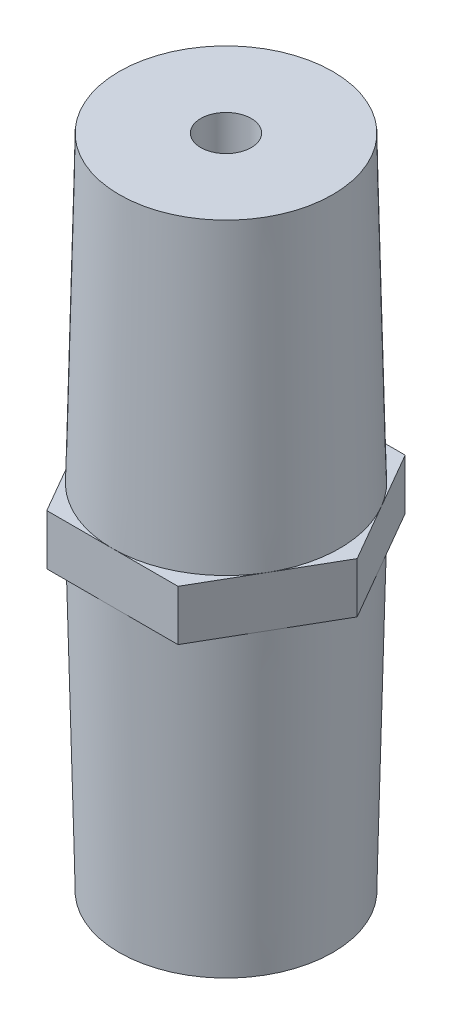
ISO-10303-21;
HEADER;
FILE_DESCRIPTION(('STEP AP214'),'2;1');
FILE_NAME('part.step','',(''),(''),'','','');
FILE_SCHEMA(('AUTOMOTIVE_DESIGN { 1 0 10303 214 1 1 1 1 }'));
ENDSEC;
DATA;
#1=APPLICATION_CONTEXT('core data for automotive mechanical design processes');
#2=APPLICATION_PROTOCOL_DEFINITION('international standard','automotive_design',2000,#1);
#3=PRODUCT_CONTEXT('',#1,'mechanical');
#4=PRODUCT('Part','Part','',(#3));
#5=PRODUCT_RELATED_PRODUCT_CATEGORY('part','',(#4));
#6=PRODUCT_DEFINITION_FORMATION('','',#4);
#7=PRODUCT_DEFINITION_CONTEXT('part definition',#1,'design');
#8=PRODUCT_DEFINITION('design','',#6,#7);
#9=PRODUCT_DEFINITION_SHAPE('','',#8);
#10=(LENGTH_UNIT() NAMED_UNIT(*) SI_UNIT(.MILLI.,.METRE.));
#11=(NAMED_UNIT(*) PLANE_ANGLE_UNIT() SI_UNIT($,.RADIAN.));
#12=(NAMED_UNIT(*) SI_UNIT($,.STERADIAN.) SOLID_ANGLE_UNIT());
#13=UNCERTAINTY_MEASURE_WITH_UNIT(LENGTH_MEASURE(1.E-05),#10,'distance_accuracy_value','');
#14=(GEOMETRIC_REPRESENTATION_CONTEXT(3) GLOBAL_UNCERTAINTY_ASSIGNED_CONTEXT((#13)) GLOBAL_UNIT_ASSIGNED_CONTEXT((#10,
#11,#12)) REPRESENTATION_CONTEXT('',''));
#15=CARTESIAN_POINT('',(0.,0.,0.));
#16=DIRECTION('',(0.,0.,1.));
#17=DIRECTION('',(1.,0.,0.));
#18=AXIS2_PLACEMENT_3D('',#15,#16,#17);
#19=CARTESIAN_POINT('',(0.,-1.5875,0.));
#20=DIRECTION('',(0.,-1.,0.));
#21=DIRECTION('',(0.,0.,1.));
#22=AXIS2_PLACEMENT_3D('',#19,#20,#21);
#23=PLANE('',#22);
#24=DIRECTION('',(1.,0.,0.));
#25=VECTOR('',#24,1.);
#26=CARTESIAN_POINT('',(-4.12444598552339,-1.5875,7.14375));
#27=LINE('',#26,#25);
#28=CARTESIAN_POINT('',(0.,-1.5875,7.14375));
#29=VERTEX_POINT('',#28);
#30=CARTESIAN_POINT('',(4.12444598552339,-1.5875,7.14375));
#31=VERTEX_POINT('',#30);
#32=EDGE_CURVE('E137',#29,#31,#27,.T.);
#33=ORIENTED_EDGE('',*,*,#32,.F.);
#34=CARTESIAN_POINT('',(0.,-1.5875,0.));
#35=DIRECTION('',(0.,1.,0.));
#36=DIRECTION('',(0.,0.,1.));
#37=AXIS2_PLACEMENT_3D('',#34,#35,#36);
#38=CIRCLE('',#37,7.14375);
#39=CARTESIAN_POINT('',(6.18666897828508,-1.5875,3.571875));
#40=VERTEX_POINT('',#39);
#41=EDGE_CURVE('E49',#29,#40,#38,.T.);
#42=ORIENTED_EDGE('',*,*,#41,.T.);
#43=DIRECTION('',(0.5,0.,-0.866025403784439));
#44=VECTOR('',#43,1.);
#45=CARTESIAN_POINT('',(4.12444598552339,-1.5875,7.14375));
#46=LINE('',#45,#44);
#47=EDGE_CURVE('E136',#31,#40,#46,.T.);
#48=ORIENTED_EDGE('',*,*,#47,.F.);
#49=EDGE_LOOP('',(#33,#42,#48));
#50=FACE_BOUND('',#49,.T.);
#51=ADVANCED_FACE('F38',(#50),#23,.T.);
#52=CARTESIAN_POINT('',(8.24889197104678,-1.5875,0.));
#53=VERTEX_POINT('',#52);
#54=EDGE_CURVE('E142',#40,#53,#46,.T.);
#55=ORIENTED_EDGE('',*,*,#54,.F.);
#56=CARTESIAN_POINT('',(6.18666897828508,-1.5875,-3.571875));
#57=VERTEX_POINT('',#56);
#58=EDGE_CURVE('E11',#40,#57,#38,.T.);
#59=ORIENTED_EDGE('',*,*,#58,.T.);
#60=DIRECTION('',(-0.5,0.,-0.866025403784439));
#61=VECTOR('',#60,1.);
#62=CARTESIAN_POINT('',(8.24889197104678,-1.5875,0.));
#63=LINE('',#62,#61);
#64=EDGE_CURVE('E145',#53,#57,#63,.T.);
#65=ORIENTED_EDGE('',*,*,#64,.F.);
#66=EDGE_LOOP('',(#55,#59,#65));
#67=FACE_BOUND('',#66,.T.);
#68=ADVANCED_FACE('F143',(#67),#23,.T.);
#69=CARTESIAN_POINT('',(4.12444598552339,-1.5875,-7.14375));
#70=VERTEX_POINT('',#69);
#71=EDGE_CURVE('E170',#57,#70,#63,.T.);
#72=ORIENTED_EDGE('',*,*,#71,.F.);
#73=CARTESIAN_POINT('',(0.,-1.5875,-7.14375));
#74=VERTEX_POINT('',#73);
#75=EDGE_CURVE('E47',#57,#74,#38,.T.);
#76=ORIENTED_EDGE('',*,*,#75,.T.);
#77=DIRECTION('',(-1.,0.,0.));
#78=VECTOR('',#77,1.);
#79=CARTESIAN_POINT('',(4.12444598552339,-1.5875,-7.14375));
#80=LINE('',#79,#78);
#81=EDGE_CURVE('E167',#70,#74,#80,.T.);
#82=ORIENTED_EDGE('',*,*,#81,.F.);
#83=EDGE_LOOP('',(#72,#76,#82));
#84=FACE_BOUND('',#83,.T.);
#85=ADVANCED_FACE('F300',(#84),#23,.T.);
#86=CARTESIAN_POINT('',(-4.12444598552339,-1.5875,-7.14375));
#87=VERTEX_POINT('',#86);
#88=EDGE_CURVE('E166',#74,#87,#80,.T.);
#89=ORIENTED_EDGE('',*,*,#88,.F.);
#90=CARTESIAN_POINT('',(-6.18666897828508,-1.5875,-3.571875));
#91=VERTEX_POINT('',#90);
#92=EDGE_CURVE('E232',#74,#91,#38,.T.);
#93=ORIENTED_EDGE('',*,*,#92,.T.);
#94=DIRECTION('',(-0.5,0.,0.866025403784439));
#95=VECTOR('',#94,1.);
#96=CARTESIAN_POINT('',(-4.12444598552339,-1.5875,-7.14375));
#97=LINE('',#96,#95);
#98=EDGE_CURVE('E163',#87,#91,#97,.T.);
#99=ORIENTED_EDGE('',*,*,#98,.F.);
#100=EDGE_LOOP('',(#89,#93,#99));
#101=FACE_BOUND('',#100,.T.);
#102=ADVANCED_FACE('F298',(#101),#23,.T.);
#103=CARTESIAN_POINT('',(-8.24889197104677,-1.5875,0.));
#104=VERTEX_POINT('',#103);
#105=EDGE_CURVE('E162',#91,#104,#97,.T.);
#106=ORIENTED_EDGE('',*,*,#105,.F.);
#107=CARTESIAN_POINT('',(-6.18666897828508,-1.5875,3.571875));
#108=VERTEX_POINT('',#107);
#109=EDGE_CURVE('E227',#91,#108,#38,.T.);
#110=ORIENTED_EDGE('',*,*,#109,.T.);
#111=DIRECTION('',(0.5,0.,0.866025403784439));
#112=VECTOR('',#111,1.);
#113=CARTESIAN_POINT('',(-8.24889197104677,-1.5875,0.));
#114=LINE('',#113,#112);
#115=EDGE_CURVE('E159',#104,#108,#114,.T.);
#116=ORIENTED_EDGE('',*,*,#115,.F.);
#117=EDGE_LOOP('',(#106,#110,#116));
#118=FACE_BOUND('',#117,.T.);
#119=ADVANCED_FACE('F294',(#118),#23,.T.);
#120=CARTESIAN_POINT('',(0.,1.5875,0.));
#121=DIRECTION('',(0.,1.,0.));
#122=DIRECTION('',(0.,0.,1.));
#123=AXIS2_PLACEMENT_3D('',#120,#121,#122);
#124=PLANE('',#123);
#125=CARTESIAN_POINT('',(0.,1.5875,0.));
#126=DIRECTION('',(0.,1.,0.));
#127=DIRECTION('',(0.,0.,1.));
#128=AXIS2_PLACEMENT_3D('',#125,#126,#127);
#129=CIRCLE('',#128,7.14375);
#130=CARTESIAN_POINT('',(0.,1.5875,7.14375));
#131=VERTEX_POINT('',#130);
#132=CARTESIAN_POINT('',(6.18666897828508,1.5875,3.571875));
#133=VERTEX_POINT('',#132);
#134=EDGE_CURVE('E172',#131,#133,#129,.T.);
#135=ORIENTED_EDGE('',*,*,#134,.F.);
#136=DIRECTION('',(1.,0.,0.));
#137=VECTOR('',#136,1.);
#138=CARTESIAN_POINT('',(-4.12444598552339,1.5875,7.14375));
#139=LINE('',#138,#137);
#140=CARTESIAN_POINT('',(4.12444598552339,1.5875,7.14375));
#141=VERTEX_POINT('',#140);
#142=EDGE_CURVE('E199',#131,#141,#139,.T.);
#143=ORIENTED_EDGE('',*,*,#142,.T.);
#144=DIRECTION('',(0.5,0.,-0.866025403784439));
#145=VECTOR('',#144,1.);
#146=CARTESIAN_POINT('',(4.12444598552339,1.5875,7.14375));
#147=LINE('',#146,#145);
#148=EDGE_CURVE('E180',#141,#133,#147,.T.);
#149=ORIENTED_EDGE('',*,*,#148,.T.);
#150=EDGE_LOOP('',(#135,#143,#149));
#151=FACE_BOUND('',#150,.T.);
#152=ADVANCED_FACE('F262',(#151),#124,.T.);
#153=CARTESIAN_POINT('',(6.18666897828508,1.5875,-3.571875));
#154=VERTEX_POINT('',#153);
#155=EDGE_CURVE('E176',#133,#154,#129,.T.);
#156=ORIENTED_EDGE('',*,*,#155,.F.);
#157=CARTESIAN_POINT('',(8.24889197104678,1.5875,0.));
#158=VERTEX_POINT('',#157);
#159=EDGE_CURVE('E179',#133,#158,#147,.T.);
#160=ORIENTED_EDGE('',*,*,#159,.T.);
#161=DIRECTION('',(-0.5,0.,-0.866025403784439));
#162=VECTOR('',#161,1.);
#163=CARTESIAN_POINT('',(8.24889197104678,1.5875,0.));
#164=LINE('',#163,#162);
#165=EDGE_CURVE('E184',#158,#154,#164,.T.);
#166=ORIENTED_EDGE('',*,*,#165,.T.);
#167=EDGE_LOOP('',(#156,#160,#166));
#168=FACE_BOUND('',#167,.T.);
#169=ADVANCED_FACE('F266',(#168),#124,.T.);
#170=CARTESIAN_POINT('',(0.,1.5875,-7.14375));
#171=VERTEX_POINT('',#170);
#172=EDGE_CURVE('E224',#154,#171,#129,.T.);
#173=ORIENTED_EDGE('',*,*,#172,.F.);
#174=CARTESIAN_POINT('',(4.12444598552339,1.5875,-7.14375));
#175=VERTEX_POINT('',#174);
#176=EDGE_CURVE('E183',#154,#175,#164,.T.);
#177=ORIENTED_EDGE('',*,*,#176,.T.);
#178=DIRECTION('',(-1.,0.,0.));
#179=VECTOR('',#178,1.);
#180=CARTESIAN_POINT('',(4.12444598552339,1.5875,-7.14375));
#181=LINE('',#180,#179);
#182=EDGE_CURVE('E188',#175,#171,#181,.T.);
#183=ORIENTED_EDGE('',*,*,#182,.T.);
#184=EDGE_LOOP('',(#173,#177,#183));
#185=FACE_BOUND('',#184,.T.);
#186=ADVANCED_FACE('F270',(#185),#124,.T.);
#187=CARTESIAN_POINT('',(-6.18666897828508,1.5875,-3.571875));
#188=VERTEX_POINT('',#187);
#189=EDGE_CURVE('E222',#171,#188,#129,.T.);
#190=ORIENTED_EDGE('',*,*,#189,.F.);
#191=CARTESIAN_POINT('',(-4.12444598552339,1.5875,-7.14375));
#192=VERTEX_POINT('',#191);
#193=EDGE_CURVE('E187',#171,#192,#181,.T.);
#194=ORIENTED_EDGE('',*,*,#193,.T.);
#195=DIRECTION('',(-0.5,0.,0.866025403784439));
#196=VECTOR('',#195,1.);
#197=CARTESIAN_POINT('',(-4.12444598552339,1.5875,-7.14375));
#198=LINE('',#197,#196);
#199=EDGE_CURVE('E192',#192,#188,#198,.T.);
#200=ORIENTED_EDGE('',*,*,#199,.T.);
#201=EDGE_LOOP('',(#190,#194,#200));
#202=FACE_BOUND('',#201,.T.);
#203=ADVANCED_FACE('F276',(#202),#124,.T.);
#204=CARTESIAN_POINT('',(-6.18666897828508,1.5875,3.571875));
#205=VERTEX_POINT('',#204);
#206=EDGE_CURVE('E219',#188,#205,#129,.T.);
#207=ORIENTED_EDGE('',*,*,#206,.F.);
#208=CARTESIAN_POINT('',(-8.24889197104677,1.5875,0.));
#209=VERTEX_POINT('',#208);
#210=EDGE_CURVE('E191',#188,#209,#198,.T.);
#211=ORIENTED_EDGE('',*,*,#210,.T.);
#212=DIRECTION('',(0.5,0.,0.866025403784439));
#213=VECTOR('',#212,1.);
#214=CARTESIAN_POINT('',(-8.24889197104677,1.5875,0.));
#215=LINE('',#214,#213);
#216=EDGE_CURVE('E196',#209,#205,#215,.T.);
#217=ORIENTED_EDGE('',*,*,#216,.T.);
#218=EDGE_LOOP('',(#207,#211,#217));
#219=FACE_BOUND('',#218,.T.);
#220=ADVANCED_FACE('F284',(#219),#124,.T.);
#221=CARTESIAN_POINT('',(4.12444598552339,1.5875,7.14375));
#222=DIRECTION('',(-0.866025403784439,0.,-0.5));
#223=DIRECTION('',(-0.5,0.,0.866025403784439));
#224=AXIS2_PLACEMENT_3D('',#221,#222,#223);
#225=PLANE('',#224);
#226=DIRECTION('',(0.,-1.,0.));
#227=VECTOR('',#226,1.);
#228=CARTESIAN_POINT('',(4.12444598552339,1.5875,7.14375));
#229=LINE('',#228,#227);
#230=EDGE_CURVE('E153',#141,#31,#229,.T.);
#231=ORIENTED_EDGE('',*,*,#230,.T.);
#232=ORIENTED_EDGE('',*,*,#47,.T.);
#233=ORIENTED_EDGE('',*,*,#54,.T.);
#234=DIRECTION('',(0.,-1.,0.));
#235=VECTOR('',#234,1.);
#236=CARTESIAN_POINT('',(8.24889197104678,1.5875,0.));
#237=LINE('',#236,#235);
#238=EDGE_CURVE('E42',#158,#53,#237,.T.);
#239=ORIENTED_EDGE('',*,*,#238,.F.);
#240=ORIENTED_EDGE('',*,*,#159,.F.);
#241=ORIENTED_EDGE('',*,*,#148,.F.);
#242=EDGE_LOOP('',(#231,#232,#233,#239,#240,#241));
#243=FACE_BOUND('',#242,.T.);
#244=ADVANCED_FACE('F40',(#243),#225,.F.);
#245=CARTESIAN_POINT('',(8.24889197104678,1.5875,0.));
#246=DIRECTION('',(-0.866025403784439,0.,0.5));
#247=DIRECTION('',(0.5,0.,0.866025403784439));
#248=AXIS2_PLACEMENT_3D('',#245,#246,#247);
#249=PLANE('',#248);
#250=ORIENTED_EDGE('',*,*,#238,.T.);
#251=ORIENTED_EDGE('',*,*,#64,.T.);
#252=ORIENTED_EDGE('',*,*,#71,.T.);
#253=DIRECTION('',(0.,-1.,0.));
#254=VECTOR('',#253,1.);
#255=CARTESIAN_POINT('',(4.12444598552339,1.5875,-7.14375));
#256=LINE('',#255,#254);
#257=EDGE_CURVE('E211',#175,#70,#256,.T.);
#258=ORIENTED_EDGE('',*,*,#257,.F.);
#259=ORIENTED_EDGE('',*,*,#176,.F.);
#260=ORIENTED_EDGE('',*,*,#165,.F.);
#261=EDGE_LOOP('',(#250,#251,#252,#258,#259,#260));
#262=FACE_BOUND('',#261,.T.);
#263=ADVANCED_FACE('F268',(#262),#249,.F.);
#264=CARTESIAN_POINT('',(4.12444598552339,1.5875,-7.14375));
#265=DIRECTION('',(0.,0.,1.));
#266=DIRECTION('',(1.,0.,0.));
#267=AXIS2_PLACEMENT_3D('',#264,#265,#266);
#268=PLANE('',#267);
#269=ORIENTED_EDGE('',*,*,#257,.T.);
#270=ORIENTED_EDGE('',*,*,#81,.T.);
#271=ORIENTED_EDGE('',*,*,#88,.T.);
#272=DIRECTION('',(0.,-1.,0.));
#273=VECTOR('',#272,1.);
#274=CARTESIAN_POINT('',(-4.12444598552339,1.5875,-7.14375));
#275=LINE('',#274,#273);
#276=EDGE_CURVE('E209',#192,#87,#275,.T.);
#277=ORIENTED_EDGE('',*,*,#276,.F.);
#278=ORIENTED_EDGE('',*,*,#193,.F.);
#279=ORIENTED_EDGE('',*,*,#182,.F.);
#280=EDGE_LOOP('',(#269,#270,#271,#277,#278,#279));
#281=FACE_BOUND('',#280,.T.);
#282=ADVANCED_FACE('F272',(#281),#268,.F.);
#283=CARTESIAN_POINT('',(-4.12444598552339,1.5875,-7.14375));
#284=DIRECTION('',(0.866025403784439,0.,0.5));
#285=DIRECTION('',(0.5,0.,-0.866025403784439));
#286=AXIS2_PLACEMENT_3D('',#283,#284,#285);
#287=PLANE('',#286);
#288=ORIENTED_EDGE('',*,*,#276,.T.);
#289=ORIENTED_EDGE('',*,*,#98,.T.);
#290=ORIENTED_EDGE('',*,*,#105,.T.);
#291=DIRECTION('',(0.,-1.,0.));
#292=VECTOR('',#291,1.);
#293=CARTESIAN_POINT('',(-8.24889197104677,1.5875,0.));
#294=LINE('',#293,#292);
#295=EDGE_CURVE('E206',#209,#104,#294,.T.);
#296=ORIENTED_EDGE('',*,*,#295,.F.);
#297=ORIENTED_EDGE('',*,*,#210,.F.);
#298=ORIENTED_EDGE('',*,*,#199,.F.);
#299=EDGE_LOOP('',(#288,#289,#290,#296,#297,#298));
#300=FACE_BOUND('',#299,.T.);
#301=ADVANCED_FACE('F279',(#300),#287,.F.);
#302=CARTESIAN_POINT('',(-8.24889197104677,1.5875,0.));
#303=DIRECTION('',(0.866025403784439,0.,-0.5));
#304=DIRECTION('',(-0.5,0.,-0.866025403784439));
#305=AXIS2_PLACEMENT_3D('',#302,#303,#304);
#306=PLANE('',#305);
#307=ORIENTED_EDGE('',*,*,#295,.T.);
#308=ORIENTED_EDGE('',*,*,#115,.T.);
#309=CARTESIAN_POINT('',(-4.12444598552339,-1.5875,7.14375));
#310=VERTEX_POINT('',#309);
#311=EDGE_CURVE('E158',#108,#310,#114,.T.);
#312=ORIENTED_EDGE('',*,*,#311,.T.);
#313=DIRECTION('',(0.,-1.,0.));
#314=VECTOR('',#313,1.);
#315=CARTESIAN_POINT('',(-4.12444598552339,1.5875,7.14375));
#316=LINE('',#315,#314);
#317=CARTESIAN_POINT('',(-4.12444598552339,1.5875,7.14375));
#318=VERTEX_POINT('',#317);
#319=EDGE_CURVE('E203',#318,#310,#316,.T.);
#320=ORIENTED_EDGE('',*,*,#319,.F.);
#321=EDGE_CURVE('E195',#205,#318,#215,.T.);
#322=ORIENTED_EDGE('',*,*,#321,.F.);
#323=ORIENTED_EDGE('',*,*,#216,.F.);
#324=EDGE_LOOP('',(#307,#308,#312,#320,#322,#323));
#325=FACE_BOUND('',#324,.T.);
#326=ADVANCED_FACE('F286',(#325),#306,.F.);
#327=CARTESIAN_POINT('',(-4.12444598552339,1.5875,7.14375));
#328=DIRECTION('',(0.,0.,-1.));
#329=DIRECTION('',(-1.,0.,0.));
#330=AXIS2_PLACEMENT_3D('',#327,#328,#329);
#331=PLANE('',#330);
#332=ORIENTED_EDGE('',*,*,#319,.T.);
#333=EDGE_CURVE('E154',#310,#29,#27,.T.);
#334=ORIENTED_EDGE('',*,*,#333,.T.);
#335=ORIENTED_EDGE('',*,*,#32,.T.);
#336=ORIENTED_EDGE('',*,*,#230,.F.);
#337=ORIENTED_EDGE('',*,*,#142,.F.);
#338=EDGE_CURVE('E200',#318,#131,#139,.T.);
#339=ORIENTED_EDGE('',*,*,#338,.F.);
#340=EDGE_LOOP('',(#332,#334,#335,#336,#337,#339));
#341=FACE_BOUND('',#340,.T.);
#342=ADVANCED_FACE('F291',(#341),#331,.F.);
#343=EDGE_CURVE('E63',#205,#131,#129,.T.);
#344=ORIENTED_EDGE('',*,*,#343,.F.);
#345=ORIENTED_EDGE('',*,*,#321,.T.);
#346=ORIENTED_EDGE('',*,*,#338,.T.);
#347=EDGE_LOOP('',(#344,#345,#346));
#348=FACE_BOUND('',#347,.T.);
#349=ADVANCED_FACE('F258',(#348),#124,.T.);
#350=CARTESIAN_POINT('',(0.,1.5875,0.));
#351=DIRECTION('',(0.,-1.,0.));
#352=DIRECTION('',(0.,0.,1.));
#353=AXIS2_PLACEMENT_3D('',#350,#351,#352);
#354=CONICAL_SURFACE('',#353,7.14375,0.0226892802759263);
#355=CARTESIAN_POINT('',(0.,20.6375,0.));
#356=DIRECTION('',(0.,1.,0.));
#357=DIRECTION('',(0.,0.,1.));
#358=AXIS2_PLACEMENT_3D('',#355,#356,#357);
#359=CIRCLE('',#358,6.71144502416799);
#360=CARTESIAN_POINT('',(0.,20.6375,6.71144502416799));
#361=VERTEX_POINT('',#360);
#362=EDGE_CURVE('E175',#361,#361,#359,.T.);
#363=ORIENTED_EDGE('',*,*,#362,.F.);
#364=EDGE_LOOP('',(#363));
#365=FACE_BOUND('',#364,.T.);
#366=ORIENTED_EDGE('',*,*,#134,.T.);
#367=ORIENTED_EDGE('',*,*,#155,.T.);
#368=ORIENTED_EDGE('',*,*,#172,.T.);
#369=ORIENTED_EDGE('',*,*,#189,.T.);
#370=ORIENTED_EDGE('',*,*,#206,.T.);
#371=ORIENTED_EDGE('',*,*,#343,.T.);
#372=EDGE_LOOP('',(#366,#367,#368,#369,#370,#371));
#373=FACE_BOUND('',#372,.T.);
#374=ADVANCED_FACE('F253',(#365,#373),#354,.T.);
#375=CARTESIAN_POINT('',(0.,20.6375,0.));
#376=DIRECTION('',(0.,1.,0.));
#377=DIRECTION('',(0.,0.,1.));
#378=AXIS2_PLACEMENT_3D('',#375,#376,#377);
#379=PLANE('',#378);
#380=CARTESIAN_POINT('',(0.,20.6375,0.));
#381=DIRECTION('',(0.,1.,0.));
#382=DIRECTION('',(0.,0.,1.));
#383=AXIS2_PLACEMENT_3D('',#380,#381,#382);
#384=CIRCLE('',#383,1.5875);
#385=CARTESIAN_POINT('',(0.,20.6375,1.5875));
#386=VERTEX_POINT('',#385);
#387=EDGE_CURVE('E234',#386,#386,#384,.T.);
#388=ORIENTED_EDGE('',*,*,#387,.F.);
#389=EDGE_LOOP('',(#388));
#390=FACE_BOUND('',#389,.T.);
#391=ORIENTED_EDGE('',*,*,#362,.T.);
#392=EDGE_LOOP('',(#391));
#393=FACE_BOUND('',#392,.T.);
#394=ADVANCED_FACE('F249',(#390,#393),#379,.T.);
#395=ORIENTED_EDGE('',*,*,#311,.F.);
#396=EDGE_CURVE('E141',#108,#29,#38,.T.);
#397=ORIENTED_EDGE('',*,*,#396,.T.);
#398=ORIENTED_EDGE('',*,*,#333,.F.);
#399=EDGE_LOOP('',(#395,#397,#398));
#400=FACE_BOUND('',#399,.T.);
#401=ADVANCED_FACE('F252',(#400),#23,.T.);
#402=CARTESIAN_POINT('',(0.,-1.5875,0.));
#403=DIRECTION('',(0.,1.,0.));
#404=DIRECTION('',(0.,0.,1.));
#405=AXIS2_PLACEMENT_3D('',#402,#403,#404);
#406=CONICAL_SURFACE('',#405,7.14375,0.0226892802759263);
#407=CARTESIAN_POINT('',(0.,-20.6375,0.));
#408=DIRECTION('',(0.,-1.,0.));
#409=DIRECTION('',(0.,0.,-1.));
#410=AXIS2_PLACEMENT_3D('',#407,#408,#409);
#411=CIRCLE('',#410,6.71144502416799);
#412=CARTESIAN_POINT('',(0.,-20.6375,-6.71144502416799));
#413=VERTEX_POINT('',#412);
#414=EDGE_CURVE('E139',#413,#413,#411,.F.);
#415=ORIENTED_EDGE('',*,*,#414,.T.);
#416=EDGE_LOOP('',(#415));
#417=FACE_BOUND('',#416,.T.);
#418=ORIENTED_EDGE('',*,*,#41,.F.);
#419=ORIENTED_EDGE('',*,*,#396,.F.);
#420=ORIENTED_EDGE('',*,*,#109,.F.);
#421=ORIENTED_EDGE('',*,*,#92,.F.);
#422=ORIENTED_EDGE('',*,*,#75,.F.);
#423=ORIENTED_EDGE('',*,*,#58,.F.);
#424=EDGE_LOOP('',(#418,#419,#420,#421,#422,#423));
#425=FACE_BOUND('',#424,.T.);
#426=ADVANCED_FACE('F126',(#417,#425),#406,.T.);
#427=CARTESIAN_POINT('',(0.,-20.6375,0.));
#428=DIRECTION('',(0.,-1.,0.));
#429=DIRECTION('',(0.,0.,1.));
#430=AXIS2_PLACEMENT_3D('',#427,#428,#429);
#431=PLANE('',#430);
#432=CARTESIAN_POINT('',(0.,-20.6375,0.));
#433=DIRECTION('',(0.,1.,0.));
#434=DIRECTION('',(0.,0.,1.));
#435=AXIS2_PLACEMENT_3D('',#432,#433,#434);
#436=CIRCLE('',#435,1.5875);
#437=CARTESIAN_POINT('',(0.,-20.6375,1.5875));
#438=VERTEX_POINT('',#437);
#439=EDGE_CURVE('E140',#438,#438,#436,.T.);
#440=ORIENTED_EDGE('',*,*,#439,.T.);
#441=EDGE_LOOP('',(#440));
#442=FACE_BOUND('',#441,.T.);
#443=ORIENTED_EDGE('',*,*,#414,.F.);
#444=EDGE_LOOP('',(#443));
#445=FACE_BOUND('',#444,.T.);
#446=ADVANCED_FACE('F240',(#442,#445),#431,.T.);
#447=CARTESIAN_POINT('',(0.,-20.6375,0.));
#448=DIRECTION('',(0.,1.,0.));
#449=DIRECTION('',(0.,0.,1.));
#450=AXIS2_PLACEMENT_3D('',#447,#448,#449);
#451=CYLINDRICAL_SURFACE('',#450,1.5875);
#452=ORIENTED_EDGE('',*,*,#439,.F.);
#453=EDGE_LOOP('',(#452));
#454=FACE_BOUND('',#453,.T.);
#455=ORIENTED_EDGE('',*,*,#387,.T.);
#456=EDGE_LOOP('',(#455));
#457=FACE_BOUND('',#456,.T.);
#458=ADVANCED_FACE('F243',(#454,#457),#451,.F.);
#459=CLOSED_SHELL('',(#51,#68,#85,#102,#119,#152,#169,#186,#203,#220,#244,#263,#282,#301,#326,
#342,#349,#374,#394,#401,#426,#446,#458));
#460=MANIFOLD_SOLID_BREP('B2',#459);
#461=ADVANCED_BREP_SHAPE_REPRESENTATION('',(#18,#460),#14);
#462=SHAPE_DEFINITION_REPRESENTATION(#9,#461);
ENDSEC;
END-ISO-10303-21;
